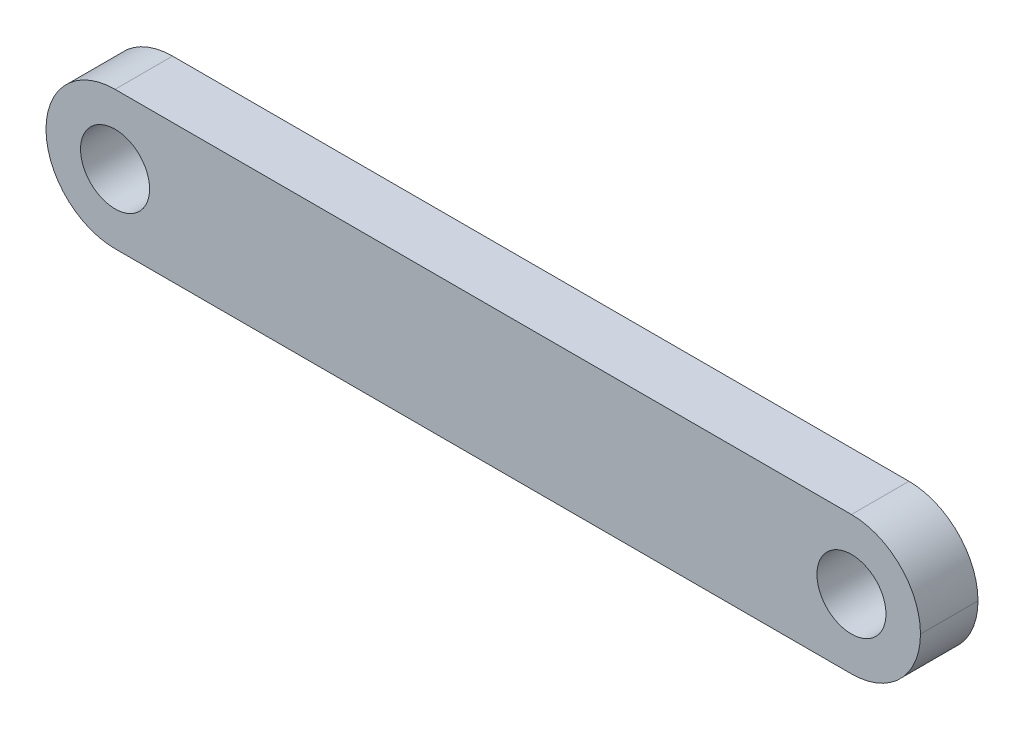
ISO-10303-21;
HEADER;
FILE_DESCRIPTION(('STEP AP214'),'2;1');
FILE_NAME('part.step','',(''),(''),'','','');
FILE_SCHEMA(('AUTOMOTIVE_DESIGN { 1 0 10303 214 1 1 1 1 }'));
ENDSEC;
DATA;
#1=APPLICATION_CONTEXT('core data for automotive mechanical design processes');
#2=APPLICATION_PROTOCOL_DEFINITION('international standard','automotive_design',2000,#1);
#3=PRODUCT_CONTEXT('',#1,'mechanical');
#4=PRODUCT('Part','Part','',(#3));
#5=PRODUCT_RELATED_PRODUCT_CATEGORY('part','',(#4));
#6=PRODUCT_DEFINITION_FORMATION('','',#4);
#7=PRODUCT_DEFINITION_CONTEXT('part definition',#1,'design');
#8=PRODUCT_DEFINITION('design','',#6,#7);
#9=PRODUCT_DEFINITION_SHAPE('','',#8);
#10=(LENGTH_UNIT() NAMED_UNIT(*) SI_UNIT(.MILLI.,.METRE.));
#11=(NAMED_UNIT(*) PLANE_ANGLE_UNIT() SI_UNIT($,.RADIAN.));
#12=(NAMED_UNIT(*) SI_UNIT($,.STERADIAN.) SOLID_ANGLE_UNIT());
#13=UNCERTAINTY_MEASURE_WITH_UNIT(LENGTH_MEASURE(1.E-05),#10,'distance_accuracy_value','');
#14=(GEOMETRIC_REPRESENTATION_CONTEXT(3) GLOBAL_UNCERTAINTY_ASSIGNED_CONTEXT((#13)) GLOBAL_UNIT_ASSIGNED_CONTEXT((#10,
#11,#12)) REPRESENTATION_CONTEXT('',''));
#15=CARTESIAN_POINT('',(0.,0.,0.));
#16=DIRECTION('',(0.,0.,1.));
#17=DIRECTION('',(1.,0.,0.));
#18=AXIS2_PLACEMENT_3D('',#15,#16,#17);
#19=CARTESIAN_POINT('',(38.,-5.99999999999999,5.));
#20=DIRECTION('',(0.,1.,0.));
#21=DIRECTION('',(-1.,0.,0.));
#22=AXIS2_PLACEMENT_3D('',#19,#20,#21);
#23=PLANE('',#22);
#24=DIRECTION('',(1.,0.,0.));
#25=VECTOR('',#24,1.);
#26=CARTESIAN_POINT('',(38.,-5.99999999999999,5.));
#27=LINE('',#26,#25);
#28=CARTESIAN_POINT('',(-32.,-6.,5.));
#29=VERTEX_POINT('',#28);
#30=CARTESIAN_POINT('',(32.,-5.99999999999999,5.));
#31=VERTEX_POINT('',#30);
#32=EDGE_CURVE('E109',#29,#31,#27,.T.);
#33=ORIENTED_EDGE('',*,*,#32,.F.);
#34=DIRECTION('',(0.,0.,-1.));
#35=VECTOR('',#34,1.);
#36=CARTESIAN_POINT('',(-32.,-6.,5.));
#37=LINE('',#36,#35);
#38=CARTESIAN_POINT('',(-32.,-6.,0.));
#39=VERTEX_POINT('',#38);
#40=EDGE_CURVE('E93',#29,#39,#37,.T.);
#41=ORIENTED_EDGE('',*,*,#40,.T.);
#42=DIRECTION('',(1.,0.,0.));
#43=VECTOR('',#42,1.);
#44=CARTESIAN_POINT('',(38.,-5.99999999999999,0.));
#45=LINE('',#44,#43);
#46=CARTESIAN_POINT('',(32.,-5.99999999999999,0.));
#47=VERTEX_POINT('',#46);
#48=EDGE_CURVE('E106',#39,#47,#45,.T.);
#49=ORIENTED_EDGE('',*,*,#48,.T.);
#50=DIRECTION('',(0.,0.,-1.));
#51=VECTOR('',#50,1.);
#52=CARTESIAN_POINT('',(32.,-5.99999999999999,5.));
#53=LINE('',#52,#51);
#54=EDGE_CURVE('E110',#47,#31,#53,.F.);
#55=ORIENTED_EDGE('',*,*,#54,.T.);
#56=EDGE_LOOP('',(#33,#41,#49,#55));
#57=FACE_BOUND('',#56,.T.);
#58=ADVANCED_FACE('F35',(#57),#23,.F.);
#59=CARTESIAN_POINT('',(38.,6.00000000000001,5.));
#60=DIRECTION('',(0.,-1.,0.));
#61=DIRECTION('',(1.,0.,0.));
#62=AXIS2_PLACEMENT_3D('',#59,#60,#61);
#63=PLANE('',#62);
#64=DIRECTION('',(-1.,0.,0.));
#65=VECTOR('',#64,1.);
#66=CARTESIAN_POINT('',(38.,6.00000000000001,5.));
#67=LINE('',#66,#65);
#68=CARTESIAN_POINT('',(32.,6.00000000000001,5.));
#69=VERTEX_POINT('',#68);
#70=CARTESIAN_POINT('',(-32.,6.,5.));
#71=VERTEX_POINT('',#70);
#72=EDGE_CURVE('E119',#69,#71,#67,.T.);
#73=ORIENTED_EDGE('',*,*,#72,.F.);
#74=DIRECTION('',(0.,0.,-1.));
#75=VECTOR('',#74,1.);
#76=CARTESIAN_POINT('',(32.,6.00000000000001,5.));
#77=LINE('',#76,#75);
#78=CARTESIAN_POINT('',(32.,6.00000000000001,0.));
#79=VERTEX_POINT('',#78);
#80=EDGE_CURVE('E11',#69,#79,#77,.T.);
#81=ORIENTED_EDGE('',*,*,#80,.T.);
#82=DIRECTION('',(-1.,0.,0.));
#83=VECTOR('',#82,1.);
#84=CARTESIAN_POINT('',(38.,6.00000000000001,0.));
#85=LINE('',#84,#83);
#86=CARTESIAN_POINT('',(-32.,6.,0.));
#87=VERTEX_POINT('',#86);
#88=EDGE_CURVE('E115',#79,#87,#85,.T.);
#89=ORIENTED_EDGE('',*,*,#88,.T.);
#90=DIRECTION('',(0.,0.,-1.));
#91=VECTOR('',#90,1.);
#92=CARTESIAN_POINT('',(-32.,6.,5.));
#93=LINE('',#92,#91);
#94=EDGE_CURVE('E44',#87,#71,#93,.F.);
#95=ORIENTED_EDGE('',*,*,#94,.T.);
#96=EDGE_LOOP('',(#73,#81,#89,#95));
#97=FACE_BOUND('',#96,.T.);
#98=ADVANCED_FACE('F155',(#97),#63,.F.);
#99=CARTESIAN_POINT('',(0.,0.,5.));
#100=DIRECTION('',(0.,0.,1.));
#101=DIRECTION('',(1.,0.,0.));
#102=AXIS2_PLACEMENT_3D('',#99,#100,#101);
#103=PLANE('',#102);
#104=CARTESIAN_POINT('',(-32.,0.,5.));
#105=DIRECTION('',(0.,0.,1.));
#106=DIRECTION('',(1.,0.,0.));
#107=AXIS2_PLACEMENT_3D('',#104,#105,#106);
#108=CIRCLE('',#107,2.99999999999999);
#109=CARTESIAN_POINT('',(-29.,0.,5.));
#110=VERTEX_POINT('',#109);
#111=EDGE_CURVE('E230',#110,#110,#108,.T.);
#112=ORIENTED_EDGE('',*,*,#111,.F.);
#113=EDGE_LOOP('',(#112));
#114=FACE_BOUND('',#113,.T.);
#115=CARTESIAN_POINT('',(32.,0.,5.));
#116=DIRECTION('',(0.,0.,1.));
#117=DIRECTION('',(1.,0.,0.));
#118=AXIS2_PLACEMENT_3D('',#115,#116,#117);
#119=CIRCLE('',#118,2.99999999999999);
#120=CARTESIAN_POINT('',(35.,0.,5.));
#121=VERTEX_POINT('',#120);
#122=EDGE_CURVE('E143',#121,#121,#119,.T.);
#123=ORIENTED_EDGE('',*,*,#122,.F.);
#124=EDGE_LOOP('',(#123));
#125=FACE_BOUND('',#124,.T.);
#126=ORIENTED_EDGE('',*,*,#32,.T.);
#127=CARTESIAN_POINT('',(32.,0.,5.));
#128=DIRECTION('',(0.,0.,1.));
#129=DIRECTION('',(1.,0.,0.));
#130=AXIS2_PLACEMENT_3D('',#127,#128,#129);
#131=CIRCLE('',#130,6.);
#132=CARTESIAN_POINT('',(38.,0.,5.));
#133=VERTEX_POINT('',#132);
#134=EDGE_CURVE('E131',#31,#133,#131,.T.);
#135=ORIENTED_EDGE('',*,*,#134,.T.);
#136=CARTESIAN_POINT('',(32.,0.,5.));
#137=DIRECTION('',(0.,0.,1.));
#138=DIRECTION('',(1.,0.,0.));
#139=AXIS2_PLACEMENT_3D('',#136,#137,#138);
#140=CIRCLE('',#139,6.);
#141=EDGE_CURVE('E58',#133,#69,#140,.T.);
#142=ORIENTED_EDGE('',*,*,#141,.T.);
#143=ORIENTED_EDGE('',*,*,#72,.T.);
#144=CARTESIAN_POINT('',(-32.,0.,5.));
#145=DIRECTION('',(0.,0.,1.));
#146=DIRECTION('',(1.,0.,0.));
#147=AXIS2_PLACEMENT_3D('',#144,#145,#146);
#148=CIRCLE('',#147,6.);
#149=CARTESIAN_POINT('',(-38.,0.,5.));
#150=VERTEX_POINT('',#149);
#151=EDGE_CURVE('E126',#71,#150,#148,.T.);
#152=ORIENTED_EDGE('',*,*,#151,.T.);
#153=CARTESIAN_POINT('',(-32.,0.,5.));
#154=DIRECTION('',(0.,0.,1.));
#155=DIRECTION('',(1.,0.,0.));
#156=AXIS2_PLACEMENT_3D('',#153,#154,#155);
#157=CIRCLE('',#156,6.);
#158=EDGE_CURVE('E128',#150,#29,#157,.T.);
#159=ORIENTED_EDGE('',*,*,#158,.T.);
#160=EDGE_LOOP('',(#126,#135,#142,#143,#152,#159));
#161=FACE_BOUND('',#160,.T.);
#162=ADVANCED_FACE('F133',(#114,#125,#161),#103,.T.);
#163=CARTESIAN_POINT('',(0.,0.,0.));
#164=DIRECTION('',(0.,0.,1.));
#165=DIRECTION('',(1.,0.,0.));
#166=AXIS2_PLACEMENT_3D('',#163,#164,#165);
#167=PLANE('',#166);
#168=CARTESIAN_POINT('',(-32.,0.,0.));
#169=DIRECTION('',(0.,0.,1.));
#170=DIRECTION('',(1.,0.,0.));
#171=AXIS2_PLACEMENT_3D('',#168,#169,#170);
#172=CIRCLE('',#171,3.);
#173=CARTESIAN_POINT('',(-29.,0.,0.));
#174=VERTEX_POINT('',#173);
#175=EDGE_CURVE('E148',#174,#174,#172,.T.);
#176=ORIENTED_EDGE('',*,*,#175,.T.);
#177=EDGE_LOOP('',(#176));
#178=FACE_BOUND('',#177,.T.);
#179=CARTESIAN_POINT('',(32.,0.,0.));
#180=DIRECTION('',(0.,0.,1.));
#181=DIRECTION('',(1.,0.,0.));
#182=AXIS2_PLACEMENT_3D('',#179,#180,#181);
#183=CIRCLE('',#182,3.);
#184=CARTESIAN_POINT('',(35.,0.,0.));
#185=VERTEX_POINT('',#184);
#186=EDGE_CURVE('E141',#185,#185,#183,.T.);
#187=ORIENTED_EDGE('',*,*,#186,.T.);
#188=EDGE_LOOP('',(#187));
#189=FACE_BOUND('',#188,.T.);
#190=CARTESIAN_POINT('',(32.,0.,0.));
#191=DIRECTION('',(0.,0.,1.));
#192=DIRECTION('',(1.,0.,0.));
#193=AXIS2_PLACEMENT_3D('',#190,#191,#192);
#194=CIRCLE('',#193,6.);
#195=CARTESIAN_POINT('',(38.,0.,0.));
#196=VERTEX_POINT('',#195);
#197=EDGE_CURVE('E99',#79,#196,#194,.F.);
#198=ORIENTED_EDGE('',*,*,#197,.T.);
#199=CARTESIAN_POINT('',(32.,0.,0.));
#200=DIRECTION('',(0.,0.,1.));
#201=DIRECTION('',(1.,0.,0.));
#202=AXIS2_PLACEMENT_3D('',#199,#200,#201);
#203=CIRCLE('',#202,6.);
#204=EDGE_CURVE('E114',#196,#47,#203,.F.);
#205=ORIENTED_EDGE('',*,*,#204,.T.);
#206=ORIENTED_EDGE('',*,*,#48,.F.);
#207=CARTESIAN_POINT('',(-32.,0.,0.));
#208=DIRECTION('',(0.,0.,1.));
#209=DIRECTION('',(1.,0.,0.));
#210=AXIS2_PLACEMENT_3D('',#207,#208,#209);
#211=CIRCLE('',#210,6.);
#212=CARTESIAN_POINT('',(-38.,0.,0.));
#213=VERTEX_POINT('',#212);
#214=EDGE_CURVE('E89',#39,#213,#211,.F.);
#215=ORIENTED_EDGE('',*,*,#214,.T.);
#216=CARTESIAN_POINT('',(-32.,0.,0.));
#217=DIRECTION('',(0.,0.,1.));
#218=DIRECTION('',(1.,0.,0.));
#219=AXIS2_PLACEMENT_3D('',#216,#217,#218);
#220=CIRCLE('',#219,6.);
#221=EDGE_CURVE('E100',#213,#87,#220,.F.);
#222=ORIENTED_EDGE('',*,*,#221,.T.);
#223=ORIENTED_EDGE('',*,*,#88,.F.);
#224=EDGE_LOOP('',(#198,#205,#206,#215,#222,#223));
#225=FACE_BOUND('',#224,.T.);
#226=ADVANCED_FACE('F112',(#178,#189,#225),#167,.F.);
#227=CARTESIAN_POINT('',(-32.,0.,5.));
#228=DIRECTION('',(0.,0.,-1.));
#229=DIRECTION('',(-1.,0.,0.));
#230=AXIS2_PLACEMENT_3D('',#227,#228,#229);
#231=CYLINDRICAL_SURFACE('',#230,6.);
#232=DIRECTION('',(0.,0.,-1.));
#233=VECTOR('',#232,1.);
#234=CARTESIAN_POINT('',(-38.,0.,5.));
#235=LINE('',#234,#233);
#236=EDGE_CURVE('E95',#150,#213,#235,.T.);
#237=ORIENTED_EDGE('',*,*,#236,.F.);
#238=ORIENTED_EDGE('',*,*,#151,.F.);
#239=ORIENTED_EDGE('',*,*,#94,.F.);
#240=ORIENTED_EDGE('',*,*,#221,.F.);
#241=EDGE_LOOP('',(#237,#238,#239,#240));
#242=FACE_BOUND('',#241,.T.);
#243=ADVANCED_FACE('F153',(#242),#231,.T.);
#244=CARTESIAN_POINT('',(-32.,0.,5.));
#245=DIRECTION('',(0.,0.,-1.));
#246=DIRECTION('',(-1.,0.,0.));
#247=AXIS2_PLACEMENT_3D('',#244,#245,#246);
#248=CYLINDRICAL_SURFACE('',#247,6.);
#249=ORIENTED_EDGE('',*,*,#158,.F.);
#250=ORIENTED_EDGE('',*,*,#236,.T.);
#251=ORIENTED_EDGE('',*,*,#214,.F.);
#252=ORIENTED_EDGE('',*,*,#40,.F.);
#253=EDGE_LOOP('',(#249,#250,#251,#252));
#254=FACE_BOUND('',#253,.T.);
#255=ADVANCED_FACE('F92',(#254),#248,.T.);
#256=CARTESIAN_POINT('',(32.,0.,5.));
#257=DIRECTION('',(0.,0.,-1.));
#258=DIRECTION('',(-1.,0.,0.));
#259=AXIS2_PLACEMENT_3D('',#256,#257,#258);
#260=CYLINDRICAL_SURFACE('',#259,6.);
#261=ORIENTED_EDGE('',*,*,#80,.F.);
#262=ORIENTED_EDGE('',*,*,#141,.F.);
#263=DIRECTION('',(0.,0.,-1.));
#264=VECTOR('',#263,1.);
#265=CARTESIAN_POINT('',(38.,0.,5.));
#266=LINE('',#265,#264);
#267=EDGE_CURVE('E39',#196,#133,#266,.F.);
#268=ORIENTED_EDGE('',*,*,#267,.F.);
#269=ORIENTED_EDGE('',*,*,#197,.F.);
#270=EDGE_LOOP('',(#261,#262,#268,#269));
#271=FACE_BOUND('',#270,.T.);
#272=ADVANCED_FACE('F37',(#271),#260,.T.);
#273=CARTESIAN_POINT('',(32.,0.,5.));
#274=DIRECTION('',(0.,0.,-1.));
#275=DIRECTION('',(-1.,0.,0.));
#276=AXIS2_PLACEMENT_3D('',#273,#274,#275);
#277=CYLINDRICAL_SURFACE('',#276,6.);
#278=ORIENTED_EDGE('',*,*,#134,.F.);
#279=ORIENTED_EDGE('',*,*,#54,.F.);
#280=ORIENTED_EDGE('',*,*,#204,.F.);
#281=ORIENTED_EDGE('',*,*,#267,.T.);
#282=EDGE_LOOP('',(#278,#279,#280,#281));
#283=FACE_BOUND('',#282,.T.);
#284=ADVANCED_FACE('F140',(#283),#277,.T.);
#285=CARTESIAN_POINT('',(32.,0.,5.));
#286=DIRECTION('',(0.,0.,1.));
#287=DIRECTION('',(1.,0.,0.));
#288=AXIS2_PLACEMENT_3D('',#285,#286,#287);
#289=CYLINDRICAL_SURFACE('',#288,2.99999999999999);
#290=ORIENTED_EDGE('',*,*,#186,.F.);
#291=EDGE_LOOP('',(#290));
#292=FACE_BOUND('',#291,.T.);
#293=ORIENTED_EDGE('',*,*,#122,.T.);
#294=EDGE_LOOP('',(#293));
#295=FACE_BOUND('',#294,.T.);
#296=ADVANCED_FACE('F171',(#292,#295),#289,.F.);
#297=CARTESIAN_POINT('',(-32.,0.,5.));
#298=DIRECTION('',(0.,0.,1.));
#299=DIRECTION('',(1.,0.,0.));
#300=AXIS2_PLACEMENT_3D('',#297,#298,#299);
#301=CYLINDRICAL_SURFACE('',#300,2.99999999999999);
#302=ORIENTED_EDGE('',*,*,#175,.F.);
#303=EDGE_LOOP('',(#302));
#304=FACE_BOUND('',#303,.T.);
#305=ORIENTED_EDGE('',*,*,#111,.T.);
#306=EDGE_LOOP('',(#305));
#307=FACE_BOUND('',#306,.T.);
#308=ADVANCED_FACE('F176',(#304,#307),#301,.F.);
#309=CLOSED_SHELL('',(#58,#98,#162,#226,#243,#255,#272,#284,#296,#308));
#310=MANIFOLD_SOLID_BREP('B2',#309);
#311=ADVANCED_BREP_SHAPE_REPRESENTATION('',(#18,#310),#14);
#312=SHAPE_DEFINITION_REPRESENTATION(#9,#311);
ENDSEC;
END-ISO-10303-21;
